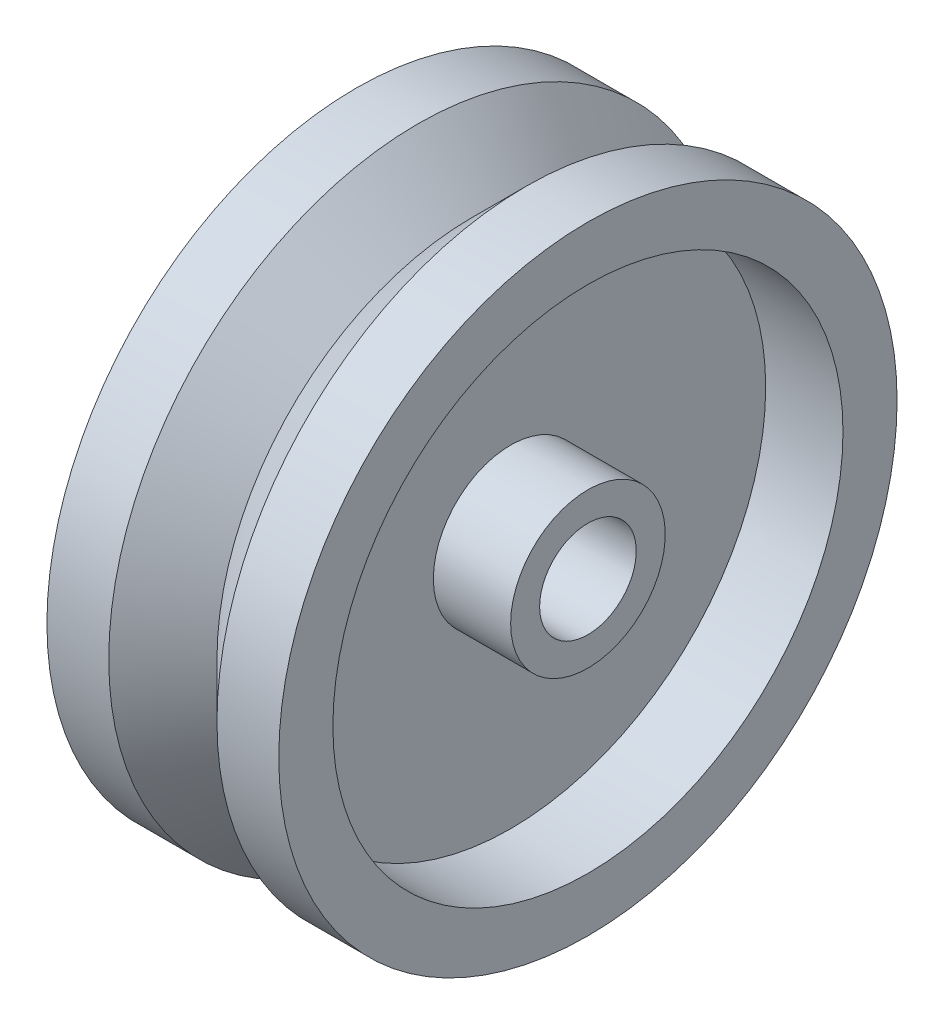
ISO-10303-21;
HEADER;
FILE_DESCRIPTION(('STEP AP214'),'2;1');
FILE_NAME('part.step','',(''),(''),'','','');
FILE_SCHEMA(('AUTOMOTIVE_DESIGN { 1 0 10303 214 1 1 1 1 }'));
ENDSEC;
DATA;
#1=APPLICATION_CONTEXT('core data for automotive mechanical design processes');
#2=APPLICATION_PROTOCOL_DEFINITION('international standard','automotive_design',2000,#1);
#3=PRODUCT_CONTEXT('',#1,'mechanical');
#4=PRODUCT('Part','Part','',(#3));
#5=PRODUCT_RELATED_PRODUCT_CATEGORY('part','',(#4));
#6=PRODUCT_DEFINITION_FORMATION('','',#4);
#7=PRODUCT_DEFINITION_CONTEXT('part definition',#1,'design');
#8=PRODUCT_DEFINITION('design','',#6,#7);
#9=PRODUCT_DEFINITION_SHAPE('','',#8);
#10=(LENGTH_UNIT() NAMED_UNIT(*) SI_UNIT(.MILLI.,.METRE.));
#11=(NAMED_UNIT(*) PLANE_ANGLE_UNIT() SI_UNIT($,.RADIAN.));
#12=(NAMED_UNIT(*) SI_UNIT($,.STERADIAN.) SOLID_ANGLE_UNIT());
#13=UNCERTAINTY_MEASURE_WITH_UNIT(LENGTH_MEASURE(1.E-05),#10,'distance_accuracy_value','');
#14=(GEOMETRIC_REPRESENTATION_CONTEXT(3) GLOBAL_UNCERTAINTY_ASSIGNED_CONTEXT((#13)) GLOBAL_UNIT_ASSIGNED_CONTEXT((#10,
#11,#12)) REPRESENTATION_CONTEXT('',''));
#15=CARTESIAN_POINT('',(0.,0.,0.));
#16=DIRECTION('',(0.,0.,1.));
#17=DIRECTION('',(1.,0.,0.));
#18=AXIS2_PLACEMENT_3D('',#15,#16,#17);
#19=CARTESIAN_POINT('',(-7.49999999999999,20.,0.));
#20=DIRECTION('',(1.,0.,0.));
#21=DIRECTION('',(0.,0.,-1.));
#22=AXIS2_PLACEMENT_3D('',#19,#20,#21);
#23=PLANE('',#22);
#24=CARTESIAN_POINT('',(-7.49999999999999,0.,0.));
#25=DIRECTION('',(-1.,0.,0.));
#26=DIRECTION('',(0.,0.,1.));
#27=AXIS2_PLACEMENT_3D('',#24,#25,#26);
#28=CIRCLE('',#27,16.5);
#29=CARTESIAN_POINT('',(-7.49999999999999,0.,16.5));
#30=VERTEX_POINT('',#29);
#31=EDGE_CURVE('E10',#30,#30,#28,.T.);
#32=ORIENTED_EDGE('',*,*,#31,.F.);
#33=EDGE_LOOP('',(#32));
#34=FACE_BOUND('',#33,.T.);
#35=CARTESIAN_POINT('',(-7.49999999999999,0.,0.));
#36=DIRECTION('',(-1.,0.,0.));
#37=DIRECTION('',(0.,0.,1.));
#38=AXIS2_PLACEMENT_3D('',#35,#36,#37);
#39=CIRCLE('',#38,20.);
#40=CARTESIAN_POINT('',(-7.49999999999999,0.,20.));
#41=VERTEX_POINT('',#40);
#42=EDGE_CURVE('E106',#41,#41,#39,.T.);
#43=ORIENTED_EDGE('',*,*,#42,.T.);
#44=EDGE_LOOP('',(#43));
#45=FACE_BOUND('',#44,.T.);
#46=ADVANCED_FACE('F43',(#34,#45),#23,.F.);
#47=CARTESIAN_POINT('',(0.,0.,0.));
#48=DIRECTION('',(-1.,0.,0.));
#49=DIRECTION('',(0.,0.,1.));
#50=AXIS2_PLACEMENT_3D('',#47,#48,#49);
#51=CYLINDRICAL_SURFACE('',#50,16.5);
#52=CARTESIAN_POINT('',(-2.5,0.,0.));
#53=DIRECTION('',(-1.,0.,0.));
#54=DIRECTION('',(0.,0.,1.));
#55=AXIS2_PLACEMENT_3D('',#52,#53,#54);
#56=CIRCLE('',#55,16.5);
#57=CARTESIAN_POINT('',(-2.5,0.,16.5));
#58=VERTEX_POINT('',#57);
#59=EDGE_CURVE('E50',#58,#58,#56,.T.);
#60=ORIENTED_EDGE('',*,*,#59,.F.);
#61=EDGE_LOOP('',(#60));
#62=FACE_BOUND('',#61,.T.);
#63=ORIENTED_EDGE('',*,*,#31,.T.);
#64=EDGE_LOOP('',(#63));
#65=FACE_BOUND('',#64,.T.);
#66=ADVANCED_FACE('F186',(#62,#65),#51,.F.);
#67=CARTESIAN_POINT('',(-2.5,16.5,0.));
#68=DIRECTION('',(1.,0.,0.));
#69=DIRECTION('',(0.,0.,-1.));
#70=AXIS2_PLACEMENT_3D('',#67,#68,#69);
#71=PLANE('',#70);
#72=CARTESIAN_POINT('',(-2.5,0.,0.));
#73=DIRECTION('',(-1.,0.,0.));
#74=DIRECTION('',(0.,0.,1.));
#75=AXIS2_PLACEMENT_3D('',#72,#73,#74);
#76=CIRCLE('',#75,5.);
#77=CARTESIAN_POINT('',(-2.5,0.,5.));
#78=VERTEX_POINT('',#77);
#79=EDGE_CURVE('E55',#78,#78,#76,.T.);
#80=ORIENTED_EDGE('',*,*,#79,.F.);
#81=EDGE_LOOP('',(#80));
#82=FACE_BOUND('',#81,.T.);
#83=ORIENTED_EDGE('',*,*,#59,.T.);
#84=EDGE_LOOP('',(#83));
#85=FACE_BOUND('',#84,.T.);
#86=ADVANCED_FACE('F181',(#82,#85),#71,.F.);
#87=CARTESIAN_POINT('',(0.,0.,0.));
#88=DIRECTION('',(-1.,0.,0.));
#89=DIRECTION('',(0.,0.,1.));
#90=AXIS2_PLACEMENT_3D('',#87,#88,#89);
#91=CYLINDRICAL_SURFACE('',#90,5.);
#92=CARTESIAN_POINT('',(-7.5,0.,0.));
#93=DIRECTION('',(-1.,0.,0.));
#94=DIRECTION('',(0.,0.,1.));
#95=AXIS2_PLACEMENT_3D('',#92,#93,#94);
#96=CIRCLE('',#95,5.);
#97=CARTESIAN_POINT('',(-7.5,0.,5.));
#98=VERTEX_POINT('',#97);
#99=EDGE_CURVE('E60',#98,#98,#96,.T.);
#100=ORIENTED_EDGE('',*,*,#99,.F.);
#101=EDGE_LOOP('',(#100));
#102=FACE_BOUND('',#101,.T.);
#103=ORIENTED_EDGE('',*,*,#79,.T.);
#104=EDGE_LOOP('',(#103));
#105=FACE_BOUND('',#104,.T.);
#106=ADVANCED_FACE('F175',(#102,#105),#91,.T.);
#107=CARTESIAN_POINT('',(-7.5,5.,0.));
#108=DIRECTION('',(1.,0.,0.));
#109=DIRECTION('',(0.,0.,-1.));
#110=AXIS2_PLACEMENT_3D('',#107,#108,#109);
#111=PLANE('',#110);
#112=CARTESIAN_POINT('',(-7.5,0.,0.));
#113=DIRECTION('',(-1.,0.,0.));
#114=DIRECTION('',(0.,0.,1.));
#115=AXIS2_PLACEMENT_3D('',#112,#113,#114);
#116=CIRCLE('',#115,3.125);
#117=CARTESIAN_POINT('',(-7.5,0.,3.125));
#118=VERTEX_POINT('',#117);
#119=EDGE_CURVE('E66',#118,#118,#116,.T.);
#120=ORIENTED_EDGE('',*,*,#119,.F.);
#121=EDGE_LOOP('',(#120));
#122=FACE_BOUND('',#121,.T.);
#123=ORIENTED_EDGE('',*,*,#99,.T.);
#124=EDGE_LOOP('',(#123));
#125=FACE_BOUND('',#124,.T.);
#126=ADVANCED_FACE('F169',(#122,#125),#111,.F.);
#127=CARTESIAN_POINT('',(0.,0.,0.));
#128=DIRECTION('',(-1.,0.,0.));
#129=DIRECTION('',(0.,0.,1.));
#130=AXIS2_PLACEMENT_3D('',#127,#128,#129);
#131=CYLINDRICAL_SURFACE('',#130,3.125);
#132=CARTESIAN_POINT('',(7.5,0.,0.));
#133=DIRECTION('',(-1.,0.,0.));
#134=DIRECTION('',(0.,0.,1.));
#135=AXIS2_PLACEMENT_3D('',#132,#133,#134);
#136=CIRCLE('',#135,3.125);
#137=CARTESIAN_POINT('',(7.5,0.,3.125));
#138=VERTEX_POINT('',#137);
#139=EDGE_CURVE('E70',#138,#138,#136,.T.);
#140=ORIENTED_EDGE('',*,*,#139,.F.);
#141=EDGE_LOOP('',(#140));
#142=FACE_BOUND('',#141,.T.);
#143=ORIENTED_EDGE('',*,*,#119,.T.);
#144=EDGE_LOOP('',(#143));
#145=FACE_BOUND('',#144,.T.);
#146=ADVANCED_FACE('F163',(#142,#145),#131,.F.);
#147=CARTESIAN_POINT('',(7.5,5.,0.));
#148=DIRECTION('',(-1.,0.,0.));
#149=DIRECTION('',(0.,0.,1.));
#150=AXIS2_PLACEMENT_3D('',#147,#148,#149);
#151=PLANE('',#150);
#152=CARTESIAN_POINT('',(7.5,0.,0.));
#153=DIRECTION('',(-1.,0.,0.));
#154=DIRECTION('',(0.,0.,1.));
#155=AXIS2_PLACEMENT_3D('',#152,#153,#154);
#156=CIRCLE('',#155,5.);
#157=CARTESIAN_POINT('',(7.5,0.,5.));
#158=VERTEX_POINT('',#157);
#159=EDGE_CURVE('E74',#158,#158,#156,.T.);
#160=ORIENTED_EDGE('',*,*,#159,.F.);
#161=EDGE_LOOP('',(#160));
#162=FACE_BOUND('',#161,.T.);
#163=ORIENTED_EDGE('',*,*,#139,.T.);
#164=EDGE_LOOP('',(#163));
#165=FACE_BOUND('',#164,.T.);
#166=ADVANCED_FACE('F157',(#162,#165),#151,.F.);
#167=CARTESIAN_POINT('',(0.,0.,0.));
#168=DIRECTION('',(-1.,0.,0.));
#169=DIRECTION('',(0.,0.,1.));
#170=AXIS2_PLACEMENT_3D('',#167,#168,#169);
#171=CYLINDRICAL_SURFACE('',#170,5.);
#172=CARTESIAN_POINT('',(2.5,0.,0.));
#173=DIRECTION('',(-1.,0.,0.));
#174=DIRECTION('',(0.,0.,1.));
#175=AXIS2_PLACEMENT_3D('',#172,#173,#174);
#176=CIRCLE('',#175,5.);
#177=CARTESIAN_POINT('',(2.5,0.,5.));
#178=VERTEX_POINT('',#177);
#179=EDGE_CURVE('E78',#178,#178,#176,.T.);
#180=ORIENTED_EDGE('',*,*,#179,.F.);
#181=EDGE_LOOP('',(#180));
#182=FACE_BOUND('',#181,.T.);
#183=ORIENTED_EDGE('',*,*,#159,.T.);
#184=EDGE_LOOP('',(#183));
#185=FACE_BOUND('',#184,.T.);
#186=ADVANCED_FACE('F151',(#182,#185),#171,.T.);
#187=CARTESIAN_POINT('',(2.5,16.5,0.));
#188=DIRECTION('',(-1.,0.,0.));
#189=DIRECTION('',(0.,0.,1.));
#190=AXIS2_PLACEMENT_3D('',#187,#188,#189);
#191=PLANE('',#190);
#192=CARTESIAN_POINT('',(2.5,0.,0.));
#193=DIRECTION('',(-1.,0.,0.));
#194=DIRECTION('',(0.,0.,1.));
#195=AXIS2_PLACEMENT_3D('',#192,#193,#194);
#196=CIRCLE('',#195,16.5);
#197=CARTESIAN_POINT('',(2.5,0.,16.5));
#198=VERTEX_POINT('',#197);
#199=EDGE_CURVE('E82',#198,#198,#196,.T.);
#200=ORIENTED_EDGE('',*,*,#199,.F.);
#201=EDGE_LOOP('',(#200));
#202=FACE_BOUND('',#201,.T.);
#203=ORIENTED_EDGE('',*,*,#179,.T.);
#204=EDGE_LOOP('',(#203));
#205=FACE_BOUND('',#204,.T.);
#206=ADVANCED_FACE('F145',(#202,#205),#191,.F.);
#207=CARTESIAN_POINT('',(0.,0.,0.));
#208=DIRECTION('',(-1.,0.,0.));
#209=DIRECTION('',(0.,0.,1.));
#210=AXIS2_PLACEMENT_3D('',#207,#208,#209);
#211=CYLINDRICAL_SURFACE('',#210,16.5);
#212=CARTESIAN_POINT('',(7.49999999999999,0.,0.));
#213=DIRECTION('',(-1.,0.,0.));
#214=DIRECTION('',(0.,0.,1.));
#215=AXIS2_PLACEMENT_3D('',#212,#213,#214);
#216=CIRCLE('',#215,16.5);
#217=CARTESIAN_POINT('',(7.49999999999999,0.,16.5));
#218=VERTEX_POINT('',#217);
#219=EDGE_CURVE('E86',#218,#218,#216,.T.);
#220=ORIENTED_EDGE('',*,*,#219,.F.);
#221=EDGE_LOOP('',(#220));
#222=FACE_BOUND('',#221,.T.);
#223=ORIENTED_EDGE('',*,*,#199,.T.);
#224=EDGE_LOOP('',(#223));
#225=FACE_BOUND('',#224,.T.);
#226=ADVANCED_FACE('F139',(#222,#225),#211,.F.);
#227=CARTESIAN_POINT('',(7.5,20.,0.));
#228=DIRECTION('',(-1.,0.,0.));
#229=DIRECTION('',(0.,0.,1.));
#230=AXIS2_PLACEMENT_3D('',#227,#228,#229);
#231=PLANE('',#230);
#232=CARTESIAN_POINT('',(7.50000000000001,0.,0.));
#233=DIRECTION('',(-1.,0.,0.));
#234=DIRECTION('',(0.,0.,1.));
#235=AXIS2_PLACEMENT_3D('',#232,#233,#234);
#236=CIRCLE('',#235,20.);
#237=CARTESIAN_POINT('',(7.50000000000001,0.,20.));
#238=VERTEX_POINT('',#237);
#239=EDGE_CURVE('E90',#238,#238,#236,.T.);
#240=ORIENTED_EDGE('',*,*,#239,.F.);
#241=EDGE_LOOP('',(#240));
#242=FACE_BOUND('',#241,.T.);
#243=ORIENTED_EDGE('',*,*,#219,.T.);
#244=EDGE_LOOP('',(#243));
#245=FACE_BOUND('',#244,.T.);
#246=ADVANCED_FACE('F133',(#242,#245),#231,.F.);
#247=CARTESIAN_POINT('',(0.,0.,0.));
#248=DIRECTION('',(-1.,0.,0.));
#249=DIRECTION('',(0.,0.,1.));
#250=AXIS2_PLACEMENT_3D('',#247,#248,#249);
#251=CYLINDRICAL_SURFACE('',#250,20.);
#252=CARTESIAN_POINT('',(3.50000000000001,0.,0.));
#253=DIRECTION('',(-1.,0.,0.));
#254=DIRECTION('',(0.,0.,1.));
#255=AXIS2_PLACEMENT_3D('',#252,#253,#254);
#256=CIRCLE('',#255,20.);
#257=CARTESIAN_POINT('',(3.50000000000001,0.,20.));
#258=VERTEX_POINT('',#257);
#259=EDGE_CURVE('E94',#258,#258,#256,.T.);
#260=ORIENTED_EDGE('',*,*,#259,.F.);
#261=EDGE_LOOP('',(#260));
#262=FACE_BOUND('',#261,.T.);
#263=ORIENTED_EDGE('',*,*,#239,.T.);
#264=EDGE_LOOP('',(#263));
#265=FACE_BOUND('',#264,.T.);
#266=ADVANCED_FACE('F127',(#262,#265),#251,.T.);
#267=CARTESIAN_POINT('',(3.50000000000001,0.,0.));
#268=DIRECTION('',(1.,0.,0.));
#269=DIRECTION('',(0.,0.,-1.));
#270=AXIS2_PLACEMENT_3D('',#267,#268,#269);
#271=CONICAL_SURFACE('',#270,20.,0.785398163397447);
#272=CARTESIAN_POINT('',(0.,0.,0.));
#273=DIRECTION('',(-1.,0.,0.));
#274=DIRECTION('',(0.,0.,1.));
#275=AXIS2_PLACEMENT_3D('',#272,#273,#274);
#276=CIRCLE('',#275,16.5);
#277=CARTESIAN_POINT('',(0.,0.,16.5));
#278=VERTEX_POINT('',#277);
#279=EDGE_CURVE('E98',#278,#278,#276,.T.);
#280=ORIENTED_EDGE('',*,*,#279,.F.);
#281=EDGE_LOOP('',(#280));
#282=FACE_BOUND('',#281,.T.);
#283=ORIENTED_EDGE('',*,*,#259,.T.);
#284=EDGE_LOOP('',(#283));
#285=FACE_BOUND('',#284,.T.);
#286=ADVANCED_FACE('F121',(#282,#285),#271,.T.);
#287=CARTESIAN_POINT('',(0.,0.,0.));
#288=DIRECTION('',(-1.,0.,0.));
#289=DIRECTION('',(0.,0.,1.));
#290=AXIS2_PLACEMENT_3D('',#287,#288,#289);
#291=CONICAL_SURFACE('',#290,16.5,0.78539816339745);
#292=CARTESIAN_POINT('',(-3.49999999999999,0.,0.));
#293=DIRECTION('',(-1.,0.,0.));
#294=DIRECTION('',(0.,0.,1.));
#295=AXIS2_PLACEMENT_3D('',#292,#293,#294);
#296=CIRCLE('',#295,20.);
#297=CARTESIAN_POINT('',(-3.49999999999999,0.,20.));
#298=VERTEX_POINT('',#297);
#299=EDGE_CURVE('E102',#298,#298,#296,.T.);
#300=ORIENTED_EDGE('',*,*,#299,.F.);
#301=EDGE_LOOP('',(#300));
#302=FACE_BOUND('',#301,.T.);
#303=ORIENTED_EDGE('',*,*,#279,.T.);
#304=EDGE_LOOP('',(#303));
#305=FACE_BOUND('',#304,.T.);
#306=ADVANCED_FACE('F115',(#302,#305),#291,.T.);
#307=CARTESIAN_POINT('',(0.,0.,0.));
#308=DIRECTION('',(-1.,0.,0.));
#309=DIRECTION('',(0.,0.,1.));
#310=AXIS2_PLACEMENT_3D('',#307,#308,#309);
#311=CYLINDRICAL_SURFACE('',#310,20.);
#312=ORIENTED_EDGE('',*,*,#42,.F.);
#313=EDGE_LOOP('',(#312));
#314=FACE_BOUND('',#313,.T.);
#315=ORIENTED_EDGE('',*,*,#299,.T.);
#316=EDGE_LOOP('',(#315));
#317=FACE_BOUND('',#316,.T.);
#318=ADVANCED_FACE('F112',(#314,#317),#311,.T.);
#319=CLOSED_SHELL('',(#46,#66,#86,#106,#126,#146,#166,#186,#206,#226,#246,#266,#286,#306,#318));
#320=MANIFOLD_SOLID_BREP('B2',#319);
#321=ADVANCED_BREP_SHAPE_REPRESENTATION('',(#18,#320),#14);
#322=SHAPE_DEFINITION_REPRESENTATION(#9,#321);
ENDSEC;
END-ISO-10303-21;
